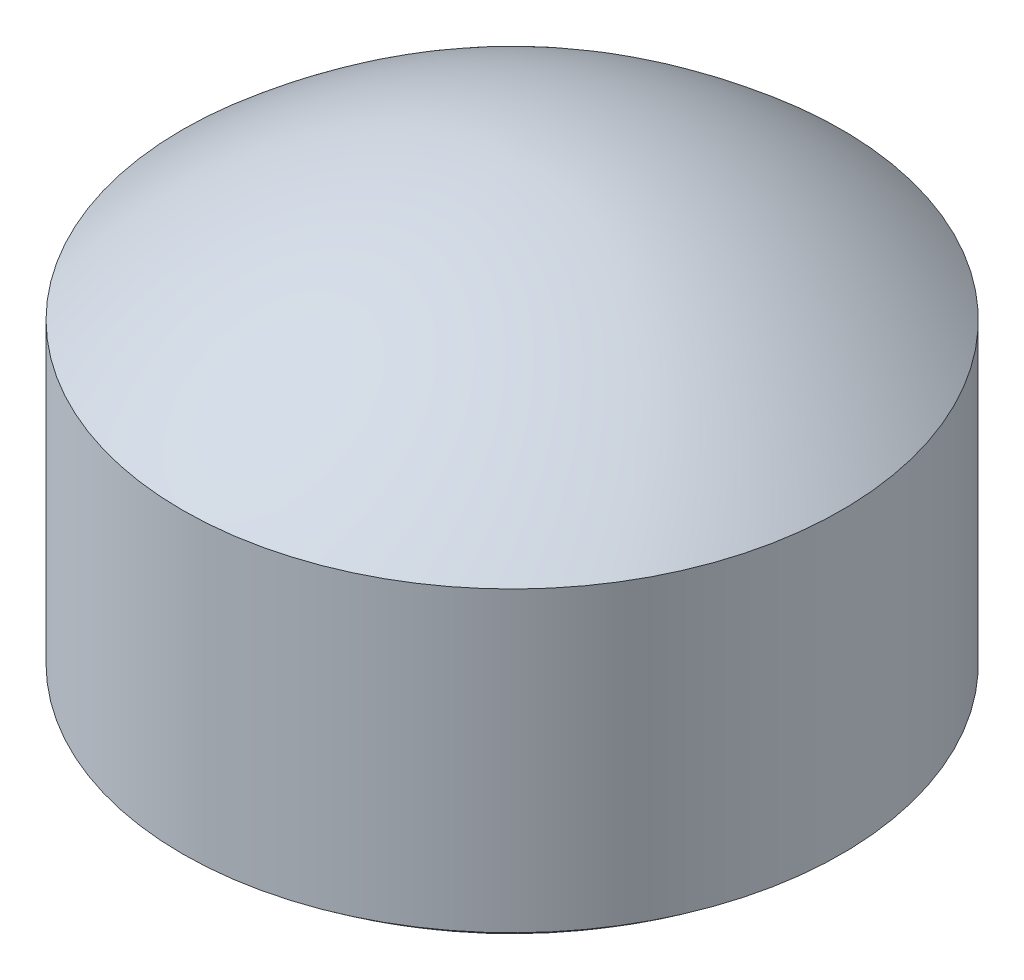
ISO-10303-21;
HEADER;
FILE_DESCRIPTION(('STEP AP214'),'2;1');
FILE_NAME('part.step','',(''),(''),'','','');
FILE_SCHEMA(('AUTOMOTIVE_DESIGN { 1 0 10303 214 1 1 1 1 }'));
ENDSEC;
DATA;
#1=APPLICATION_CONTEXT('core data for automotive mechanical design processes');
#2=APPLICATION_PROTOCOL_DEFINITION('international standard','automotive_design',2000,#1);
#3=PRODUCT_CONTEXT('',#1,'mechanical');
#4=PRODUCT('Part','Part','',(#3));
#5=PRODUCT_RELATED_PRODUCT_CATEGORY('part','',(#4));
#6=PRODUCT_DEFINITION_FORMATION('','',#4);
#7=PRODUCT_DEFINITION_CONTEXT('part definition',#1,'design');
#8=PRODUCT_DEFINITION('design','',#6,#7);
#9=PRODUCT_DEFINITION_SHAPE('','',#8);
#10=(LENGTH_UNIT() NAMED_UNIT(*) SI_UNIT(.MILLI.,.METRE.));
#11=(NAMED_UNIT(*) PLANE_ANGLE_UNIT() SI_UNIT($,.RADIAN.));
#12=(NAMED_UNIT(*) SI_UNIT($,.STERADIAN.) SOLID_ANGLE_UNIT());
#13=UNCERTAINTY_MEASURE_WITH_UNIT(LENGTH_MEASURE(1.E-05),#10,'distance_accuracy_value','');
#14=(GEOMETRIC_REPRESENTATION_CONTEXT(3) GLOBAL_UNCERTAINTY_ASSIGNED_CONTEXT((#13)) GLOBAL_UNIT_ASSIGNED_CONTEXT((#10,
#11,#12)) REPRESENTATION_CONTEXT('',''));
#15=CARTESIAN_POINT('',(0.,0.,0.));
#16=DIRECTION('',(0.,0.,1.));
#17=DIRECTION('',(1.,0.,0.));
#18=AXIS2_PLACEMENT_3D('',#15,#16,#17);
#19=CARTESIAN_POINT('',(-11.7210673242063,-4.93624193289932,0.));
#20=CARTESIAN_POINT('',(-6.65012369780094,-8.86784054471157,0.));
#21=CARTESIAN_POINT('',(-0.789590035697785,-8.86784054471157,0.));
#22=B_SPLINE_CURVE_WITH_KNOTS('',2,(#19,#20,#21),.UNSPECIFIED.,.F.,.F.,(3,3),(0.5,1.),.UNSPECIFIED.);
#23=CARTESIAN_POINT('',(-0.789590035697785,9.52842534035625,0.));
#24=DIRECTION('',(0.,1.,0.));
#25=AXIS1_PLACEMENT('',#23,#24);
#26=SURFACE_OF_REVOLUTION('',#22,#25);
#27=CARTESIAN_POINT('',(-0.789590035697785,-8.86784054471157,0.));
#28=VERTEX_POINT('',#27);
#29=VERTEX_LOOP('',#28);
#30=FACE_BOUND('',#29,.T.);
#31=CARTESIAN_POINT('',(-0.789590035697785,-4.93624193289932,0.));
#32=DIRECTION('',(0.,1.,0.));
#33=DIRECTION('',(0.,0.,1.));
#34=AXIS2_PLACEMENT_3D('',#31,#32,#33);
#35=CIRCLE('',#34,10.9314772885085);
#36=CARTESIAN_POINT('',(-0.789590035697785,-4.93624193289932,10.9314772885085));
#37=VERTEX_POINT('',#36);
#38=EDGE_CURVE('E40',#37,#37,#35,.T.);
#39=ORIENTED_EDGE('',*,*,#38,.F.);
#40=EDGE_LOOP('',(#39));
#41=FACE_BOUND('',#40,.T.);
#42=ADVANCED_FACE('F32',(#30,#41),#26,.F.);
#43=CARTESIAN_POINT('',(-0.789590035697785,9.52842534035625,0.));
#44=CARTESIAN_POINT('',(-6.48242442340874,9.42357149540866,0.));
#45=CARTESIAN_POINT('',(-11.7210673242063,4.93624193289932,0.));
#46=B_SPLINE_CURVE_WITH_KNOTS('',2,(#43,#44,#45),.UNSPECIFIED.,.F.,.F.,(3,3),(0.514225131802357,
1.),.UNSPECIFIED.);
#47=CARTESIAN_POINT('',(-0.789590035697785,9.52842534035625,0.));
#48=DIRECTION('',(0.,1.,0.));
#49=AXIS1_PLACEMENT('',#47,#48);
#50=SURFACE_OF_REVOLUTION('',#46,#49);
#51=CARTESIAN_POINT('',(-0.789590035697785,4.93624193289932,0.));
#52=DIRECTION('',(0.,1.,0.));
#53=DIRECTION('',(0.,0.,1.));
#54=AXIS2_PLACEMENT_3D('',#51,#52,#53);
#55=CIRCLE('',#54,10.9314772885085);
#56=CARTESIAN_POINT('',(-0.789590035697785,4.93624193289932,10.9314772885085));
#57=VERTEX_POINT('',#56);
#58=EDGE_CURVE('E11',#57,#57,#55,.T.);
#59=ORIENTED_EDGE('',*,*,#58,.T.);
#60=EDGE_LOOP('',(#59));
#61=FACE_BOUND('',#60,.T.);
#62=CARTESIAN_POINT('',(-0.789590035697785,9.52842534035625,0.));
#63=VERTEX_POINT('',#62);
#64=VERTEX_LOOP('',#63);
#65=FACE_BOUND('',#64,.T.);
#66=ADVANCED_FACE('F48',(#61,#65),#50,.F.);
#67=CARTESIAN_POINT('',(-0.789590035697785,9.52842534035625,0.));
#68=DIRECTION('',(0.,1.,0.));
#69=DIRECTION('',(0.,0.,1.));
#70=AXIS2_PLACEMENT_3D('',#67,#68,#69);
#71=CYLINDRICAL_SURFACE('',#70,10.9314772885085);
#72=ORIENTED_EDGE('',*,*,#38,.T.);
#73=EDGE_LOOP('',(#72));
#74=FACE_BOUND('',#73,.T.);
#75=ORIENTED_EDGE('',*,*,#58,.F.);
#76=EDGE_LOOP('',(#75));
#77=FACE_BOUND('',#76,.T.);
#78=ADVANCED_FACE('F64',(#74,#77),#71,.T.);
#79=CLOSED_SHELL('',(#42,#66,#78));
#80=MANIFOLD_SOLID_BREP('B2',#79);
#81=ADVANCED_BREP_SHAPE_REPRESENTATION('',(#18,#80),#14);
#82=SHAPE_DEFINITION_REPRESENTATION(#9,#81);
ENDSEC;
END-ISO-10303-21;
